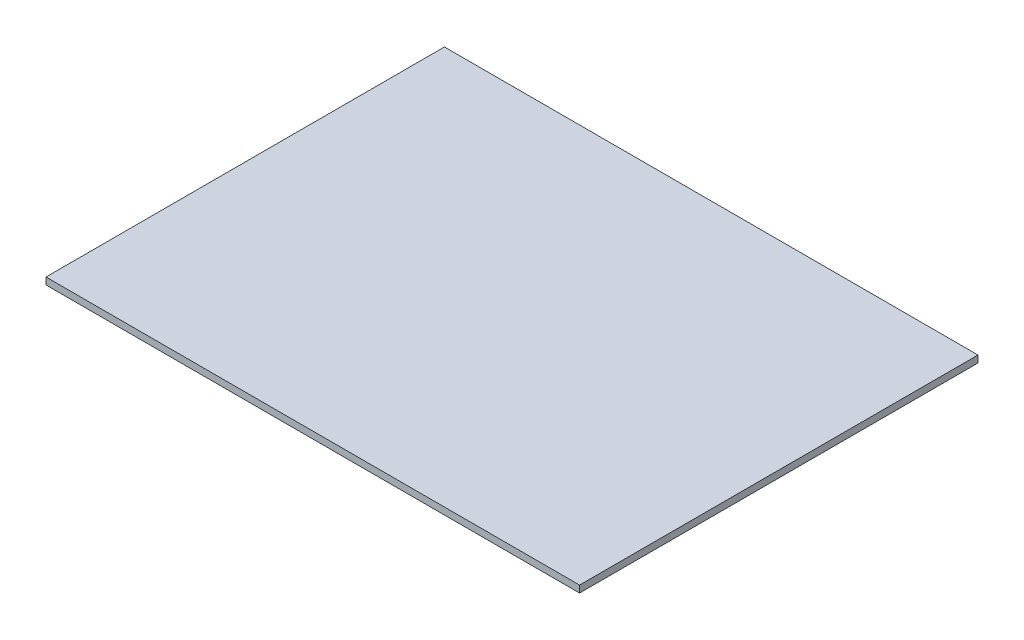
ISO-10303-21;
HEADER;
FILE_DESCRIPTION(('STEP AP214'),'2;1');
FILE_NAME('part.step','',(''),(''),'','','');
FILE_SCHEMA(('AUTOMOTIVE_DESIGN { 1 0 10303 214 1 1 1 1 }'));
ENDSEC;
DATA;
#1=APPLICATION_CONTEXT('core data for automotive mechanical design processes');
#2=APPLICATION_PROTOCOL_DEFINITION('international standard','automotive_design',2000,#1);
#3=PRODUCT_CONTEXT('',#1,'mechanical');
#4=PRODUCT('Part','Part','',(#3));
#5=PRODUCT_RELATED_PRODUCT_CATEGORY('part','',(#4));
#6=PRODUCT_DEFINITION_FORMATION('','',#4);
#7=PRODUCT_DEFINITION_CONTEXT('part definition',#1,'design');
#8=PRODUCT_DEFINITION('design','',#6,#7);
#9=PRODUCT_DEFINITION_SHAPE('','',#8);
#10=(LENGTH_UNIT() NAMED_UNIT(*) SI_UNIT(.MILLI.,.METRE.));
#11=(NAMED_UNIT(*) PLANE_ANGLE_UNIT() SI_UNIT($,.RADIAN.));
#12=(NAMED_UNIT(*) SI_UNIT($,.STERADIAN.) SOLID_ANGLE_UNIT());
#13=UNCERTAINTY_MEASURE_WITH_UNIT(LENGTH_MEASURE(1.E-05),#10,'distance_accuracy_value','');
#14=(GEOMETRIC_REPRESENTATION_CONTEXT(3) GLOBAL_UNCERTAINTY_ASSIGNED_CONTEXT((#13)) GLOBAL_UNIT_ASSIGNED_CONTEXT((#10,
#11,#12)) REPRESENTATION_CONTEXT('',''));
#15=CARTESIAN_POINT('',(0.,0.,0.));
#16=DIRECTION('',(0.,0.,1.));
#17=DIRECTION('',(1.,0.,0.));
#18=AXIS2_PLACEMENT_3D('',#15,#16,#17);
#19=CARTESIAN_POINT('',(-229.245569620253,4.,-83.6278481012658));
#20=DIRECTION('',(1.,0.,0.));
#21=DIRECTION('',(0.,0.,-1.));
#22=AXIS2_PLACEMENT_3D('',#19,#20,#21);
#23=PLANE('',#22);
#24=DIRECTION('',(0.,0.,1.));
#25=VECTOR('',#24,1.);
#26=CARTESIAN_POINT('',(-229.245569620253,0.,-83.6278481012658));
#27=LINE('',#26,#25);
#28=CARTESIAN_POINT('',(-229.245569620253,0.,-83.6278481012658));
#29=VERTEX_POINT('',#28);
#30=CARTESIAN_POINT('',(-229.245569620253,0.,146.372151898734));
#31=VERTEX_POINT('',#30);
#32=EDGE_CURVE('E98',#29,#31,#27,.T.);
#33=ORIENTED_EDGE('',*,*,#32,.T.);
#34=DIRECTION('',(0.,-1.,0.));
#35=VECTOR('',#34,1.);
#36=CARTESIAN_POINT('',(-229.245569620253,4.,146.372151898734));
#37=LINE('',#36,#35);
#38=CARTESIAN_POINT('',(-229.245569620253,4.,146.372151898734));
#39=VERTEX_POINT('',#38);
#40=EDGE_CURVE('E11',#39,#31,#37,.T.);
#41=ORIENTED_EDGE('',*,*,#40,.F.);
#42=DIRECTION('',(0.,0.,1.));
#43=VECTOR('',#42,1.);
#44=CARTESIAN_POINT('',(-229.245569620253,4.,-83.6278481012658));
#45=LINE('',#44,#43);
#46=CARTESIAN_POINT('',(-229.245569620253,4.,-83.6278481012658));
#47=VERTEX_POINT('',#46);
#48=EDGE_CURVE('E86',#47,#39,#45,.T.);
#49=ORIENTED_EDGE('',*,*,#48,.F.);
#50=DIRECTION('',(0.,-1.,0.));
#51=VECTOR('',#50,1.);
#52=CARTESIAN_POINT('',(-229.245569620253,4.,-83.6278481012658));
#53=LINE('',#52,#51);
#54=EDGE_CURVE('E94',#47,#29,#53,.T.);
#55=ORIENTED_EDGE('',*,*,#54,.T.);
#56=EDGE_LOOP('',(#33,#41,#49,#55));
#57=FACE_BOUND('',#56,.T.);
#58=ADVANCED_FACE('F35',(#57),#23,.F.);
#59=CARTESIAN_POINT('',(-229.245569620253,4.,146.372151898734));
#60=DIRECTION('',(0.,0.,-1.));
#61=DIRECTION('',(-1.,0.,0.));
#62=AXIS2_PLACEMENT_3D('',#59,#60,#61);
#63=PLANE('',#62);
#64=DIRECTION('',(1.,0.,0.));
#65=VECTOR('',#64,1.);
#66=CARTESIAN_POINT('',(-229.245569620253,0.,146.372151898734));
#67=LINE('',#66,#65);
#68=CARTESIAN_POINT('',(78.7544303797468,0.,146.372151898734));
#69=VERTEX_POINT('',#68);
#70=EDGE_CURVE('E90',#31,#69,#67,.T.);
#71=ORIENTED_EDGE('',*,*,#70,.T.);
#72=DIRECTION('',(0.,-1.,0.));
#73=VECTOR('',#72,1.);
#74=CARTESIAN_POINT('',(78.7544303797468,4.,146.372151898734));
#75=LINE('',#74,#73);
#76=CARTESIAN_POINT('',(78.7544303797468,4.,146.372151898734));
#77=VERTEX_POINT('',#76);
#78=EDGE_CURVE('E43',#77,#69,#75,.T.);
#79=ORIENTED_EDGE('',*,*,#78,.F.);
#80=DIRECTION('',(1.,0.,0.));
#81=VECTOR('',#80,1.);
#82=CARTESIAN_POINT('',(-229.245569620253,4.,146.372151898734));
#83=LINE('',#82,#81);
#84=EDGE_CURVE('E81',#39,#77,#83,.T.);
#85=ORIENTED_EDGE('',*,*,#84,.F.);
#86=ORIENTED_EDGE('',*,*,#40,.T.);
#87=EDGE_LOOP('',(#71,#79,#85,#86));
#88=FACE_BOUND('',#87,.T.);
#89=ADVANCED_FACE('F89',(#88),#63,.F.);
#90=CARTESIAN_POINT('',(78.7544303797468,4.,-83.6278481012658));
#91=DIRECTION('',(-1.,0.,0.));
#92=DIRECTION('',(0.,0.,1.));
#93=AXIS2_PLACEMENT_3D('',#90,#91,#92);
#94=PLANE('',#93);
#95=DIRECTION('',(0.,0.,-1.));
#96=VECTOR('',#95,1.);
#97=CARTESIAN_POINT('',(78.7544303797468,0.,-83.6278481012658));
#98=LINE('',#97,#96);
#99=CARTESIAN_POINT('',(78.7544303797468,0.,-83.6278481012658));
#100=VERTEX_POINT('',#99);
#101=EDGE_CURVE('E68',#69,#100,#98,.T.);
#102=ORIENTED_EDGE('',*,*,#101,.T.);
#103=DIRECTION('',(0.,-1.,0.));
#104=VECTOR('',#103,1.);
#105=CARTESIAN_POINT('',(78.7544303797468,4.,-83.6278481012658));
#106=LINE('',#105,#104);
#107=CARTESIAN_POINT('',(78.7544303797468,4.,-83.6278481012658));
#108=VERTEX_POINT('',#107);
#109=EDGE_CURVE('E91',#108,#100,#106,.T.);
#110=ORIENTED_EDGE('',*,*,#109,.F.);
#111=DIRECTION('',(0.,0.,-1.));
#112=VECTOR('',#111,1.);
#113=CARTESIAN_POINT('',(78.7544303797468,4.,-83.6278481012658));
#114=LINE('',#113,#112);
#115=EDGE_CURVE('E84',#77,#108,#114,.T.);
#116=ORIENTED_EDGE('',*,*,#115,.F.);
#117=ORIENTED_EDGE('',*,*,#78,.T.);
#118=EDGE_LOOP('',(#102,#110,#116,#117));
#119=FACE_BOUND('',#118,.T.);
#120=ADVANCED_FACE('F92',(#119),#94,.F.);
#121=CARTESIAN_POINT('',(-229.245569620253,4.,-83.6278481012658));
#122=DIRECTION('',(0.,0.,1.));
#123=DIRECTION('',(1.,0.,0.));
#124=AXIS2_PLACEMENT_3D('',#121,#122,#123);
#125=PLANE('',#124);
#126=DIRECTION('',(-1.,0.,0.));
#127=VECTOR('',#126,1.);
#128=CARTESIAN_POINT('',(-229.245569620253,0.,-83.6278481012658));
#129=LINE('',#128,#127);
#130=EDGE_CURVE('E74',#100,#29,#129,.T.);
#131=ORIENTED_EDGE('',*,*,#130,.T.);
#132=ORIENTED_EDGE('',*,*,#54,.F.);
#133=DIRECTION('',(-1.,0.,0.));
#134=VECTOR('',#133,1.);
#135=CARTESIAN_POINT('',(-229.245569620253,4.,-83.6278481012658));
#136=LINE('',#135,#134);
#137=EDGE_CURVE('E51',#108,#47,#136,.T.);
#138=ORIENTED_EDGE('',*,*,#137,.F.);
#139=ORIENTED_EDGE('',*,*,#109,.T.);
#140=EDGE_LOOP('',(#131,#132,#138,#139));
#141=FACE_BOUND('',#140,.T.);
#142=ADVANCED_FACE('F105',(#141),#125,.F.);
#143=CARTESIAN_POINT('',(0.,4.,0.));
#144=DIRECTION('',(0.,1.,0.));
#145=DIRECTION('',(0.,0.,1.));
#146=AXIS2_PLACEMENT_3D('',#143,#144,#145);
#147=PLANE('',#146);
#148=ORIENTED_EDGE('',*,*,#48,.T.);
#149=ORIENTED_EDGE('',*,*,#84,.T.);
#150=ORIENTED_EDGE('',*,*,#115,.T.);
#151=ORIENTED_EDGE('',*,*,#137,.T.);
#152=EDGE_LOOP('',(#148,#149,#150,#151));
#153=FACE_BOUND('',#152,.T.);
#154=ADVANCED_FACE('F82',(#153),#147,.T.);
#155=CARTESIAN_POINT('',(0.,0.,0.));
#156=DIRECTION('',(0.,1.,0.));
#157=DIRECTION('',(0.,0.,1.));
#158=AXIS2_PLACEMENT_3D('',#155,#156,#157);
#159=PLANE('',#158);
#160=ORIENTED_EDGE('',*,*,#32,.F.);
#161=ORIENTED_EDGE('',*,*,#130,.F.);
#162=ORIENTED_EDGE('',*,*,#101,.F.);
#163=ORIENTED_EDGE('',*,*,#70,.F.);
#164=EDGE_LOOP('',(#160,#161,#162,#163));
#165=FACE_BOUND('',#164,.T.);
#166=ADVANCED_FACE('F108',(#165),#159,.F.);
#167=CLOSED_SHELL('',(#58,#89,#120,#142,#154,#166));
#168=MANIFOLD_SOLID_BREP('B2',#167);
#169=ADVANCED_BREP_SHAPE_REPRESENTATION('',(#18,#168),#14);
#170=SHAPE_DEFINITION_REPRESENTATION(#9,#169);
ENDSEC;
END-ISO-10303-21;
